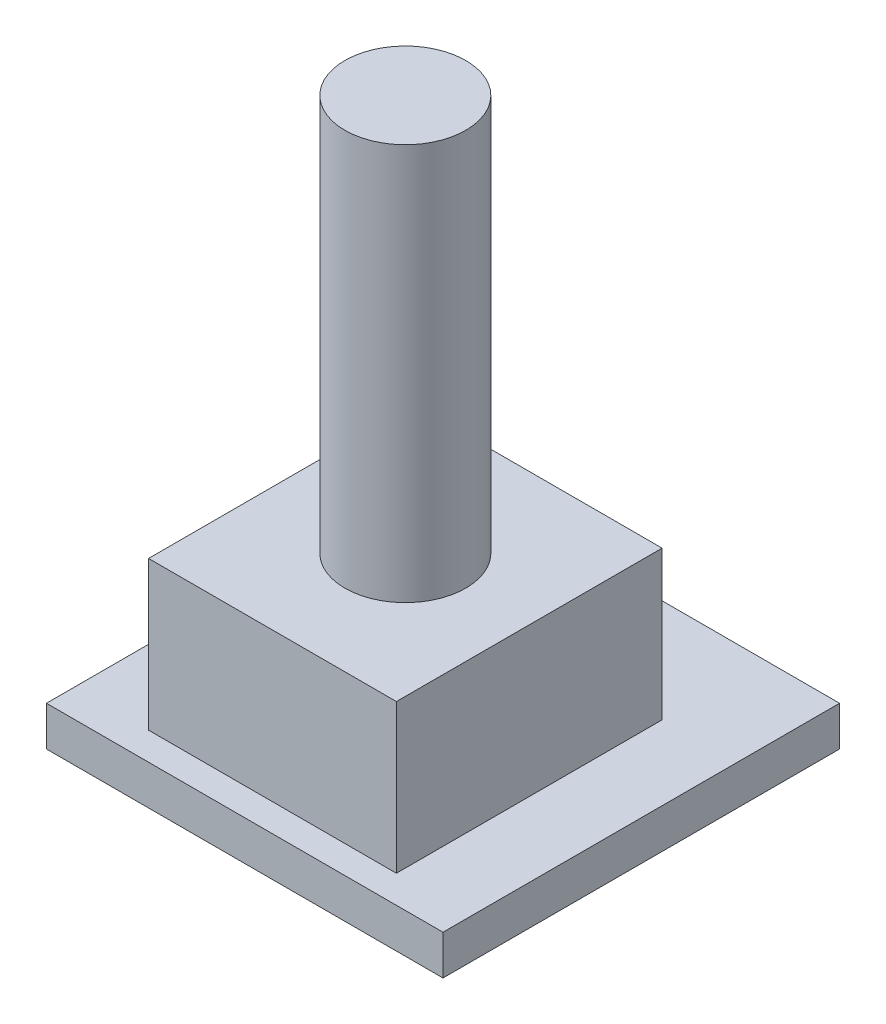
ISO-10303-21;
HEADER;
FILE_DESCRIPTION(('STEP AP214'),'2;1');
FILE_NAME('part.step','',(''),(''),'','','');
FILE_SCHEMA(('AUTOMOTIVE_DESIGN { 1 0 10303 214 1 1 1 1 }'));
ENDSEC;
DATA;
#1=APPLICATION_CONTEXT('core data for automotive mechanical design processes');
#2=APPLICATION_PROTOCOL_DEFINITION('international standard','automotive_design',2000,#1);
#3=PRODUCT_CONTEXT('',#1,'mechanical');
#4=PRODUCT('Part','Part','',(#3));
#5=PRODUCT_RELATED_PRODUCT_CATEGORY('part','',(#4));
#6=PRODUCT_DEFINITION_FORMATION('','',#4);
#7=PRODUCT_DEFINITION_CONTEXT('part definition',#1,'design');
#8=PRODUCT_DEFINITION('design','',#6,#7);
#9=PRODUCT_DEFINITION_SHAPE('','',#8);
#10=(LENGTH_UNIT() NAMED_UNIT(*) SI_UNIT(.MILLI.,.METRE.));
#11=(NAMED_UNIT(*) PLANE_ANGLE_UNIT() SI_UNIT($,.RADIAN.));
#12=(NAMED_UNIT(*) SI_UNIT($,.STERADIAN.) SOLID_ANGLE_UNIT());
#13=UNCERTAINTY_MEASURE_WITH_UNIT(LENGTH_MEASURE(1.E-05),#10,'distance_accuracy_value','');
#14=(GEOMETRIC_REPRESENTATION_CONTEXT(3) GLOBAL_UNCERTAINTY_ASSIGNED_CONTEXT((#13)) GLOBAL_UNIT_ASSIGNED_CONTEXT((#10,
#11,#12)) REPRESENTATION_CONTEXT('',''));
#15=CARTESIAN_POINT('',(0.,0.,0.));
#16=DIRECTION('',(0.,0.,1.));
#17=DIRECTION('',(1.,0.,0.));
#18=AXIS2_PLACEMENT_3D('',#15,#16,#17);
#19=CARTESIAN_POINT('',(6.25,7.5,6.7));
#20=DIRECTION('',(-1.,0.,0.));
#21=DIRECTION('',(0.,0.,1.));
#22=AXIS2_PLACEMENT_3D('',#19,#20,#21);
#23=PLANE('',#22);
#24=DIRECTION('',(0.,0.,-1.));
#25=VECTOR('',#24,1.);
#26=CARTESIAN_POINT('',(6.25,0.,6.7));
#27=LINE('',#26,#25);
#28=CARTESIAN_POINT('',(6.25,0.,6.7));
#29=VERTEX_POINT('',#28);
#30=CARTESIAN_POINT('',(6.25,0.,-6.7));
#31=VERTEX_POINT('',#30);
#32=EDGE_CURVE('E140',#29,#31,#27,.T.);
#33=ORIENTED_EDGE('',*,*,#32,.T.);
#34=DIRECTION('',(0.,-1.,0.));
#35=VECTOR('',#34,1.);
#36=CARTESIAN_POINT('',(6.25,7.5,-6.7));
#37=LINE('',#36,#35);
#38=CARTESIAN_POINT('',(6.25,7.5,-6.7));
#39=VERTEX_POINT('',#38);
#40=EDGE_CURVE('E48',#39,#31,#37,.T.);
#41=ORIENTED_EDGE('',*,*,#40,.F.);
#42=DIRECTION('',(0.,0.,-1.));
#43=VECTOR('',#42,1.);
#44=CARTESIAN_POINT('',(6.25,7.5,6.7));
#45=LINE('',#44,#43);
#46=CARTESIAN_POINT('',(6.25,7.5,6.7));
#47=VERTEX_POINT('',#46);
#48=EDGE_CURVE('E146',#47,#39,#45,.T.);
#49=ORIENTED_EDGE('',*,*,#48,.F.);
#50=DIRECTION('',(0.,-1.,0.));
#51=VECTOR('',#50,1.);
#52=CARTESIAN_POINT('',(6.25,7.5,6.7));
#53=LINE('',#52,#51);
#54=EDGE_CURVE('E158',#47,#29,#53,.T.);
#55=ORIENTED_EDGE('',*,*,#54,.T.);
#56=EDGE_LOOP('',(#33,#41,#49,#55));
#57=FACE_BOUND('',#56,.T.);
#58=ADVANCED_FACE('F45',(#57),#23,.F.);
#59=CARTESIAN_POINT('',(-6.25,7.5,-6.7));
#60=DIRECTION('',(0.,0.,1.));
#61=DIRECTION('',(1.,0.,0.));
#62=AXIS2_PLACEMENT_3D('',#59,#60,#61);
#63=PLANE('',#62);
#64=DIRECTION('',(-1.,0.,0.));
#65=VECTOR('',#64,1.);
#66=CARTESIAN_POINT('',(-6.25,0.,-6.7));
#67=LINE('',#66,#65);
#68=CARTESIAN_POINT('',(-6.25,0.,-6.7));
#69=VERTEX_POINT('',#68);
#70=EDGE_CURVE('E162',#31,#69,#67,.T.);
#71=ORIENTED_EDGE('',*,*,#70,.T.);
#72=DIRECTION('',(0.,-1.,0.));
#73=VECTOR('',#72,1.);
#74=CARTESIAN_POINT('',(-6.25,7.5,-6.7));
#75=LINE('',#74,#73);
#76=CARTESIAN_POINT('',(-6.25,7.5,-6.7));
#77=VERTEX_POINT('',#76);
#78=EDGE_CURVE('E179',#77,#69,#75,.T.);
#79=ORIENTED_EDGE('',*,*,#78,.F.);
#80=DIRECTION('',(-1.,0.,0.));
#81=VECTOR('',#80,1.);
#82=CARTESIAN_POINT('',(-6.25,7.5,-6.7));
#83=LINE('',#82,#81);
#84=EDGE_CURVE('E149',#39,#77,#83,.T.);
#85=ORIENTED_EDGE('',*,*,#84,.F.);
#86=ORIENTED_EDGE('',*,*,#40,.T.);
#87=EDGE_LOOP('',(#71,#79,#85,#86));
#88=FACE_BOUND('',#87,.T.);
#89=ADVANCED_FACE('F189',(#88),#63,.F.);
#90=CARTESIAN_POINT('',(-6.25,7.5,6.7));
#91=DIRECTION('',(1.,0.,0.));
#92=DIRECTION('',(0.,0.,-1.));
#93=AXIS2_PLACEMENT_3D('',#90,#91,#92);
#94=PLANE('',#93);
#95=DIRECTION('',(0.,0.,1.));
#96=VECTOR('',#95,1.);
#97=CARTESIAN_POINT('',(-6.25,0.,6.7));
#98=LINE('',#97,#96);
#99=CARTESIAN_POINT('',(-6.25,0.,6.7));
#100=VERTEX_POINT('',#99);
#101=EDGE_CURVE('E166',#69,#100,#98,.T.);
#102=ORIENTED_EDGE('',*,*,#101,.T.);
#103=DIRECTION('',(0.,-1.,0.));
#104=VECTOR('',#103,1.);
#105=CARTESIAN_POINT('',(-6.25,7.5,6.7));
#106=LINE('',#105,#104);
#107=CARTESIAN_POINT('',(-6.25,7.5,6.7));
#108=VERTEX_POINT('',#107);
#109=EDGE_CURVE('E176',#108,#100,#106,.T.);
#110=ORIENTED_EDGE('',*,*,#109,.F.);
#111=DIRECTION('',(0.,0.,1.));
#112=VECTOR('',#111,1.);
#113=CARTESIAN_POINT('',(-6.25,7.5,6.7));
#114=LINE('',#113,#112);
#115=EDGE_CURVE('E153',#77,#108,#114,.T.);
#116=ORIENTED_EDGE('',*,*,#115,.F.);
#117=ORIENTED_EDGE('',*,*,#78,.T.);
#118=EDGE_LOOP('',(#102,#110,#116,#117));
#119=FACE_BOUND('',#118,.T.);
#120=ADVANCED_FACE('F199',(#119),#94,.F.);
#121=CARTESIAN_POINT('',(-6.25,7.5,6.7));
#122=DIRECTION('',(0.,0.,-1.));
#123=DIRECTION('',(-1.,0.,0.));
#124=AXIS2_PLACEMENT_3D('',#121,#122,#123);
#125=PLANE('',#124);
#126=DIRECTION('',(1.,0.,0.));
#127=VECTOR('',#126,1.);
#128=CARTESIAN_POINT('',(-6.25,0.,6.7));
#129=LINE('',#128,#127);
#130=EDGE_CURVE('E150',#100,#29,#129,.T.);
#131=ORIENTED_EDGE('',*,*,#130,.T.);
#132=ORIENTED_EDGE('',*,*,#54,.F.);
#133=DIRECTION('',(1.,0.,0.));
#134=VECTOR('',#133,1.);
#135=CARTESIAN_POINT('',(-6.25,7.5,6.7));
#136=LINE('',#135,#134);
#137=EDGE_CURVE('E62',#108,#47,#136,.T.);
#138=ORIENTED_EDGE('',*,*,#137,.F.);
#139=ORIENTED_EDGE('',*,*,#109,.T.);
#140=EDGE_LOOP('',(#131,#132,#138,#139));
#141=FACE_BOUND('',#140,.T.);
#142=ADVANCED_FACE('F197',(#141),#125,.F.);
#143=CARTESIAN_POINT('',(0.,7.5,0.));
#144=DIRECTION('',(0.,-1.,0.));
#145=DIRECTION('',(0.,0.,-1.));
#146=AXIS2_PLACEMENT_3D('',#143,#144,#145);
#147=PLANE('',#146);
#148=CARTESIAN_POINT('',(0.,7.5,0.));
#149=DIRECTION('',(0.,1.,0.));
#150=DIRECTION('',(0.,0.,1.));
#151=AXIS2_PLACEMENT_3D('',#148,#149,#150);
#152=CIRCLE('',#151,3.05);
#153=CARTESIAN_POINT('',(0.,7.5,3.05));
#154=VERTEX_POINT('',#153);
#155=EDGE_CURVE('E11',#154,#154,#152,.T.);
#156=ORIENTED_EDGE('',*,*,#155,.F.);
#157=EDGE_LOOP('',(#156));
#158=FACE_BOUND('',#157,.T.);
#159=ORIENTED_EDGE('',*,*,#48,.T.);
#160=ORIENTED_EDGE('',*,*,#84,.T.);
#161=ORIENTED_EDGE('',*,*,#115,.T.);
#162=ORIENTED_EDGE('',*,*,#137,.T.);
#163=EDGE_LOOP('',(#159,#160,#161,#162));
#164=FACE_BOUND('',#163,.T.);
#165=ADVANCED_FACE('F200',(#158,#164),#147,.F.);
#166=CARTESIAN_POINT('',(0.,27.5,0.));
#167=DIRECTION('',(0.,-1.,0.));
#168=DIRECTION('',(0.,0.,-1.));
#169=AXIS2_PLACEMENT_3D('',#166,#167,#168);
#170=CYLINDRICAL_SURFACE('',#169,3.05);
#171=CARTESIAN_POINT('',(0.,27.5,0.));
#172=DIRECTION('',(0.,1.,0.));
#173=DIRECTION('',(0.,0.,1.));
#174=AXIS2_PLACEMENT_3D('',#171,#172,#173);
#175=CIRCLE('',#174,3.05);
#176=CARTESIAN_POINT('',(0.,27.5,3.05));
#177=VERTEX_POINT('',#176);
#178=EDGE_CURVE('E135',#177,#177,#175,.T.);
#179=ORIENTED_EDGE('',*,*,#178,.F.);
#180=EDGE_LOOP('',(#179));
#181=FACE_BOUND('',#180,.T.);
#182=ORIENTED_EDGE('',*,*,#155,.T.);
#183=EDGE_LOOP('',(#182));
#184=FACE_BOUND('',#183,.T.);
#185=ADVANCED_FACE('F202',(#181,#184),#170,.T.);
#186=CARTESIAN_POINT('',(0.,27.5,0.));
#187=DIRECTION('',(0.,1.,0.));
#188=DIRECTION('',(0.,0.,1.));
#189=AXIS2_PLACEMENT_3D('',#186,#187,#188);
#190=PLANE('',#189);
#191=ORIENTED_EDGE('',*,*,#178,.T.);
#192=EDGE_LOOP('',(#191));
#193=FACE_BOUND('',#192,.T.);
#194=ADVANCED_FACE('F208',(#193),#190,.T.);
#195=CARTESIAN_POINT('',(-10.,-2.,8.1));
#196=DIRECTION('',(1.,0.,0.));
#197=DIRECTION('',(0.,0.,-1.));
#198=AXIS2_PLACEMENT_3D('',#195,#196,#197);
#199=PLANE('',#198);
#200=DIRECTION('',(0.,0.,-1.));
#201=VECTOR('',#200,1.);
#202=CARTESIAN_POINT('',(-10.,0.,8.1));
#203=LINE('',#202,#201);
#204=CARTESIAN_POINT('',(-10.,0.,8.1));
#205=VERTEX_POINT('',#204);
#206=CARTESIAN_POINT('',(-10.,0.,-11.9));
#207=VERTEX_POINT('',#206);
#208=EDGE_CURVE('E133',#205,#207,#203,.T.);
#209=ORIENTED_EDGE('',*,*,#208,.T.);
#210=DIRECTION('',(0.,1.,0.));
#211=VECTOR('',#210,1.);
#212=CARTESIAN_POINT('',(-10.,-2.,-11.9));
#213=LINE('',#212,#211);
#214=CARTESIAN_POINT('',(-10.,-2.,-11.9));
#215=VERTEX_POINT('',#214);
#216=EDGE_CURVE('E111',#215,#207,#213,.T.);
#217=ORIENTED_EDGE('',*,*,#216,.F.);
#218=DIRECTION('',(0.,0.,-1.));
#219=VECTOR('',#218,1.);
#220=CARTESIAN_POINT('',(-10.,-2.,8.1));
#221=LINE('',#220,#219);
#222=CARTESIAN_POINT('',(-10.,-2.,8.1));
#223=VERTEX_POINT('',#222);
#224=EDGE_CURVE('E119',#223,#215,#221,.T.);
#225=ORIENTED_EDGE('',*,*,#224,.F.);
#226=DIRECTION('',(0.,1.,0.));
#227=VECTOR('',#226,1.);
#228=CARTESIAN_POINT('',(-10.,-2.,8.1));
#229=LINE('',#228,#227);
#230=EDGE_CURVE('E317',#223,#205,#229,.T.);
#231=ORIENTED_EDGE('',*,*,#230,.T.);
#232=EDGE_LOOP('',(#209,#217,#225,#231));
#233=FACE_BOUND('',#232,.T.);
#234=ADVANCED_FACE('F131',(#233),#199,.F.);
#235=CARTESIAN_POINT('',(-10.,-2.,-11.9));
#236=DIRECTION('',(0.,0.,1.));
#237=DIRECTION('',(1.,0.,0.));
#238=AXIS2_PLACEMENT_3D('',#235,#236,#237);
#239=PLANE('',#238);
#240=DIRECTION('',(1.,0.,0.));
#241=VECTOR('',#240,1.);
#242=CARTESIAN_POINT('',(-10.,0.,-11.9));
#243=LINE('',#242,#241);
#244=CARTESIAN_POINT('',(10.,0.,-11.9));
#245=VERTEX_POINT('',#244);
#246=EDGE_CURVE('E325',#207,#245,#243,.T.);
#247=ORIENTED_EDGE('',*,*,#246,.T.);
#248=DIRECTION('',(0.,1.,0.));
#249=VECTOR('',#248,1.);
#250=CARTESIAN_POINT('',(10.,-2.,-11.9));
#251=LINE('',#250,#249);
#252=CARTESIAN_POINT('',(10.,-2.,-11.9));
#253=VERTEX_POINT('',#252);
#254=EDGE_CURVE('E114',#253,#245,#251,.T.);
#255=ORIENTED_EDGE('',*,*,#254,.F.);
#256=DIRECTION('',(1.,0.,0.));
#257=VECTOR('',#256,1.);
#258=CARTESIAN_POINT('',(-10.,-2.,-11.9));
#259=LINE('',#258,#257);
#260=EDGE_CURVE('E107',#215,#253,#259,.T.);
#261=ORIENTED_EDGE('',*,*,#260,.F.);
#262=ORIENTED_EDGE('',*,*,#216,.T.);
#263=EDGE_LOOP('',(#247,#255,#261,#262));
#264=FACE_BOUND('',#263,.T.);
#265=ADVANCED_FACE('F109',(#264),#239,.F.);
#266=CARTESIAN_POINT('',(10.,-2.,8.1));
#267=DIRECTION('',(-1.,0.,0.));
#268=DIRECTION('',(0.,0.,1.));
#269=AXIS2_PLACEMENT_3D('',#266,#267,#268);
#270=PLANE('',#269);
#271=DIRECTION('',(0.,0.,1.));
#272=VECTOR('',#271,1.);
#273=CARTESIAN_POINT('',(10.,0.,8.1));
#274=LINE('',#273,#272);
#275=CARTESIAN_POINT('',(10.,0.,8.1));
#276=VERTEX_POINT('',#275);
#277=EDGE_CURVE('E321',#245,#276,#274,.T.);
#278=ORIENTED_EDGE('',*,*,#277,.T.);
#279=DIRECTION('',(0.,1.,0.));
#280=VECTOR('',#279,1.);
#281=CARTESIAN_POINT('',(10.,-2.,8.1));
#282=LINE('',#281,#280);
#283=CARTESIAN_POINT('',(10.,-2.,8.1));
#284=VERTEX_POINT('',#283);
#285=EDGE_CURVE('E142',#284,#276,#282,.T.);
#286=ORIENTED_EDGE('',*,*,#285,.F.);
#287=DIRECTION('',(0.,0.,1.));
#288=VECTOR('',#287,1.);
#289=CARTESIAN_POINT('',(10.,-2.,8.1));
#290=LINE('',#289,#288);
#291=EDGE_CURVE('E118',#253,#284,#290,.T.);
#292=ORIENTED_EDGE('',*,*,#291,.F.);
#293=ORIENTED_EDGE('',*,*,#254,.T.);
#294=EDGE_LOOP('',(#278,#286,#292,#293));
#295=FACE_BOUND('',#294,.T.);
#296=ADVANCED_FACE('F245',(#295),#270,.F.);
#297=CARTESIAN_POINT('',(-10.,-2.,8.1));
#298=DIRECTION('',(0.,0.,-1.));
#299=DIRECTION('',(-1.,0.,0.));
#300=AXIS2_PLACEMENT_3D('',#297,#298,#299);
#301=PLANE('',#300);
#302=DIRECTION('',(-1.,0.,0.));
#303=VECTOR('',#302,1.);
#304=CARTESIAN_POINT('',(-10.,0.,8.1));
#305=LINE('',#304,#303);
#306=EDGE_CURVE('E129',#276,#205,#305,.T.);
#307=ORIENTED_EDGE('',*,*,#306,.T.);
#308=ORIENTED_EDGE('',*,*,#230,.F.);
#309=DIRECTION('',(-1.,0.,0.));
#310=VECTOR('',#309,1.);
#311=CARTESIAN_POINT('',(-10.,-2.,8.1));
#312=LINE('',#311,#310);
#313=EDGE_CURVE('E124',#284,#223,#312,.T.);
#314=ORIENTED_EDGE('',*,*,#313,.F.);
#315=ORIENTED_EDGE('',*,*,#285,.T.);
#316=EDGE_LOOP('',(#307,#308,#314,#315));
#317=FACE_BOUND('',#316,.T.);
#318=ADVANCED_FACE('F253',(#317),#301,.F.);
#319=CARTESIAN_POINT('',(0.,-2.,0.));
#320=DIRECTION('',(0.,-1.,0.));
#321=DIRECTION('',(0.,0.,-1.));
#322=AXIS2_PLACEMENT_3D('',#319,#320,#321);
#323=PLANE('',#322);
#324=ORIENTED_EDGE('',*,*,#224,.T.);
#325=ORIENTED_EDGE('',*,*,#260,.T.);
#326=ORIENTED_EDGE('',*,*,#291,.T.);
#327=ORIENTED_EDGE('',*,*,#313,.T.);
#328=EDGE_LOOP('',(#324,#325,#326,#327));
#329=FACE_BOUND('',#328,.T.);
#330=ADVANCED_FACE('F122',(#329),#323,.T.);
#331=CARTESIAN_POINT('',(0.,0.,0.));
#332=DIRECTION('',(0.,-1.,0.));
#333=DIRECTION('',(0.,0.,-1.));
#334=AXIS2_PLACEMENT_3D('',#331,#332,#333);
#335=PLANE('',#334);
#336=ORIENTED_EDGE('',*,*,#32,.F.);
#337=ORIENTED_EDGE('',*,*,#130,.F.);
#338=ORIENTED_EDGE('',*,*,#101,.F.);
#339=ORIENTED_EDGE('',*,*,#70,.F.);
#340=EDGE_LOOP('',(#336,#337,#338,#339));
#341=FACE_BOUND('',#340,.T.);
#342=ORIENTED_EDGE('',*,*,#208,.F.);
#343=ORIENTED_EDGE('',*,*,#306,.F.);
#344=ORIENTED_EDGE('',*,*,#277,.F.);
#345=ORIENTED_EDGE('',*,*,#246,.F.);
#346=EDGE_LOOP('',(#342,#343,#344,#345));
#347=FACE_BOUND('',#346,.T.);
#348=ADVANCED_FACE('F193',(#341,#347),#335,.F.);
#349=CLOSED_SHELL('',(#58,#89,#120,#142,#165,#185,#194,#234,#265,#296,#318,#330,#348));
#350=MANIFOLD_SOLID_BREP('B2',#349);
#351=ADVANCED_BREP_SHAPE_REPRESENTATION('',(#18,#350),#14);
#352=SHAPE_DEFINITION_REPRESENTATION(#9,#351);
ENDSEC;
END-ISO-10303-21;
